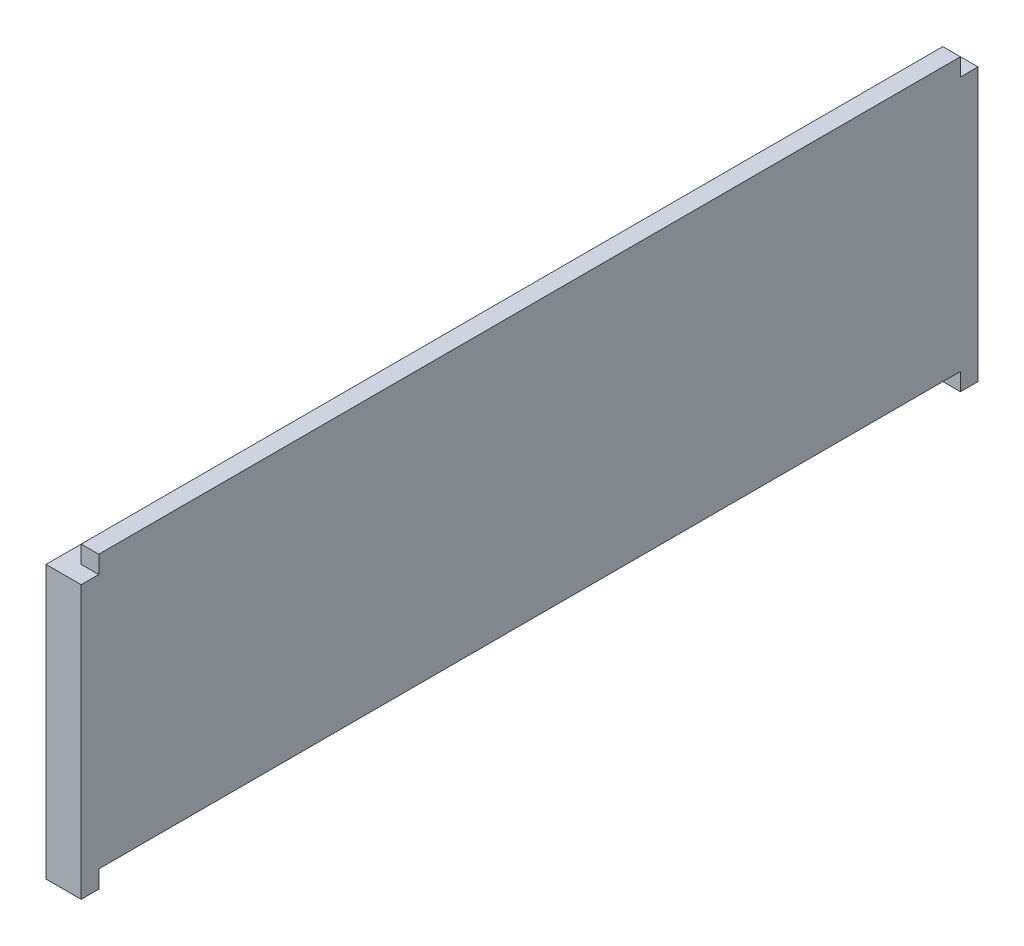
ISO-10303-21;
HEADER;
FILE_DESCRIPTION(('STEP AP214'),'2;1');
FILE_NAME('part.step','',(''),(''),'','','');
FILE_SCHEMA(('AUTOMOTIVE_DESIGN { 1 0 10303 214 1 1 1 1 }'));
ENDSEC;
DATA;
#1=APPLICATION_CONTEXT('core data for automotive mechanical design processes');
#2=APPLICATION_PROTOCOL_DEFINITION('international standard','automotive_design',2000,#1);
#3=PRODUCT_CONTEXT('',#1,'mechanical');
#4=PRODUCT('Part','Part','',(#3));
#5=PRODUCT_RELATED_PRODUCT_CATEGORY('part','',(#4));
#6=PRODUCT_DEFINITION_FORMATION('','',#4);
#7=PRODUCT_DEFINITION_CONTEXT('part definition',#1,'design');
#8=PRODUCT_DEFINITION('design','',#6,#7);
#9=PRODUCT_DEFINITION_SHAPE('','',#8);
#10=(LENGTH_UNIT() NAMED_UNIT(*) SI_UNIT(.MILLI.,.METRE.));
#11=(NAMED_UNIT(*) PLANE_ANGLE_UNIT() SI_UNIT($,.RADIAN.));
#12=(NAMED_UNIT(*) SI_UNIT($,.STERADIAN.) SOLID_ANGLE_UNIT());
#13=UNCERTAINTY_MEASURE_WITH_UNIT(LENGTH_MEASURE(1.E-05),#10,'distance_accuracy_value','');
#14=(GEOMETRIC_REPRESENTATION_CONTEXT(3) GLOBAL_UNCERTAINTY_ASSIGNED_CONTEXT((#13)) GLOBAL_UNIT_ASSIGNED_CONTEXT((#10,
#11,#12)) REPRESENTATION_CONTEXT('',''));
#15=CARTESIAN_POINT('',(0.,0.,0.));
#16=DIRECTION('',(0.,0.,1.));
#17=DIRECTION('',(1.,0.,0.));
#18=AXIS2_PLACEMENT_3D('',#15,#16,#17);
#19=CARTESIAN_POINT('',(10.,0.,490.));
#20=DIRECTION('',(0.,1.,0.));
#21=DIRECTION('',(-1.,0.,0.));
#22=AXIS2_PLACEMENT_3D('',#19,#20,#21);
#23=PLANE('',#22);
#24=DIRECTION('',(0.,0.,-1.));
#25=VECTOR('',#24,1.);
#26=CARTESIAN_POINT('',(0.,0.,490.));
#27=LINE('',#26,#25);
#28=CARTESIAN_POINT('',(0.,0.,500.));
#29=VERTEX_POINT('',#28);
#30=CARTESIAN_POINT('',(0.,0.,-10.));
#31=VERTEX_POINT('',#30);
#32=EDGE_CURVE('E138',#29,#31,#27,.T.);
#33=ORIENTED_EDGE('',*,*,#32,.T.);
#34=DIRECTION('',(-1.,0.,0.));
#35=VECTOR('',#34,1.);
#36=CARTESIAN_POINT('',(0.,0.,-10.));
#37=LINE('',#36,#35);
#38=CARTESIAN_POINT('',(20.,0.,-10.));
#39=VERTEX_POINT('',#38);
#40=EDGE_CURVE('E273',#39,#31,#37,.T.);
#41=ORIENTED_EDGE('',*,*,#40,.F.);
#42=DIRECTION('',(0.,0.,1.));
#43=VECTOR('',#42,1.);
#44=CARTESIAN_POINT('',(20.,0.,-10.));
#45=LINE('',#44,#43);
#46=CARTESIAN_POINT('',(20.,0.,0.));
#47=VERTEX_POINT('',#46);
#48=EDGE_CURVE('E280',#39,#47,#45,.T.);
#49=ORIENTED_EDGE('',*,*,#48,.T.);
#50=DIRECTION('',(-1.,0.,0.));
#51=VECTOR('',#50,1.);
#52=CARTESIAN_POINT('',(0.,0.,0.));
#53=LINE('',#52,#51);
#54=CARTESIAN_POINT('',(10.,0.,0.));
#55=VERTEX_POINT('',#54);
#56=EDGE_CURVE('E224',#47,#55,#53,.T.);
#57=ORIENTED_EDGE('',*,*,#56,.T.);
#58=DIRECTION('',(0.,0.,-1.));
#59=VECTOR('',#58,1.);
#60=CARTESIAN_POINT('',(10.,0.,490.));
#61=LINE('',#60,#59);
#62=CARTESIAN_POINT('',(10.,0.,490.));
#63=VERTEX_POINT('',#62);
#64=EDGE_CURVE('E41',#63,#55,#61,.T.);
#65=ORIENTED_EDGE('',*,*,#64,.F.);
#66=DIRECTION('',(1.,0.,0.));
#67=VECTOR('',#66,1.);
#68=CARTESIAN_POINT('',(0.,0.,490.));
#69=LINE('',#68,#67);
#70=CARTESIAN_POINT('',(20.,0.,490.));
#71=VERTEX_POINT('',#70);
#72=EDGE_CURVE('E113',#63,#71,#69,.T.);
#73=ORIENTED_EDGE('',*,*,#72,.T.);
#74=DIRECTION('',(0.,0.,-1.));
#75=VECTOR('',#74,1.);
#76=CARTESIAN_POINT('',(20.,0.,500.));
#77=LINE('',#76,#75);
#78=CARTESIAN_POINT('',(20.,0.,500.));
#79=VERTEX_POINT('',#78);
#80=EDGE_CURVE('E128',#79,#71,#77,.T.);
#81=ORIENTED_EDGE('',*,*,#80,.F.);
#82=DIRECTION('',(1.,0.,0.));
#83=VECTOR('',#82,1.);
#84=CARTESIAN_POINT('',(0.,0.,500.));
#85=LINE('',#84,#83);
#86=EDGE_CURVE('E80',#29,#79,#85,.T.);
#87=ORIENTED_EDGE('',*,*,#86,.F.);
#88=EDGE_LOOP('',(#33,#41,#49,#57,#65,#73,#81,#87));
#89=FACE_BOUND('',#88,.T.);
#90=ADVANCED_FACE('F34',(#89),#23,.F.);
#91=CARTESIAN_POINT('',(10.,10.,490.));
#92=DIRECTION('',(-1.,0.,0.));
#93=DIRECTION('',(0.,-1.,0.));
#94=AXIS2_PLACEMENT_3D('',#91,#92,#93);
#95=PLANE('',#94);
#96=DIRECTION('',(0.,1.,0.));
#97=VECTOR('',#96,1.);
#98=CARTESIAN_POINT('',(10.,10.,0.));
#99=LINE('',#98,#97);
#100=CARTESIAN_POINT('',(10.,10.,0.));
#101=VERTEX_POINT('',#100);
#102=EDGE_CURVE('E98',#55,#101,#99,.T.);
#103=ORIENTED_EDGE('',*,*,#102,.T.);
#104=DIRECTION('',(0.,0.,-1.));
#105=VECTOR('',#104,1.);
#106=CARTESIAN_POINT('',(10.,10.,490.));
#107=LINE('',#106,#105);
#108=CARTESIAN_POINT('',(10.,10.,490.));
#109=VERTEX_POINT('',#108);
#110=EDGE_CURVE('E91',#109,#101,#107,.T.);
#111=ORIENTED_EDGE('',*,*,#110,.F.);
#112=DIRECTION('',(0.,1.,0.));
#113=VECTOR('',#112,1.);
#114=CARTESIAN_POINT('',(10.,10.,490.));
#115=LINE('',#114,#113);
#116=EDGE_CURVE('E96',#63,#109,#115,.T.);
#117=ORIENTED_EDGE('',*,*,#116,.F.);
#118=ORIENTED_EDGE('',*,*,#64,.T.);
#119=EDGE_LOOP('',(#103,#111,#117,#118));
#120=FACE_BOUND('',#119,.T.);
#121=ADVANCED_FACE('F93',(#120),#95,.F.);
#122=CARTESIAN_POINT('',(20.,10.,490.));
#123=DIRECTION('',(0.,1.,0.));
#124=DIRECTION('',(-1.,0.,0.));
#125=AXIS2_PLACEMENT_3D('',#122,#123,#124);
#126=PLANE('',#125);
#127=DIRECTION('',(1.,0.,0.));
#128=VECTOR('',#127,1.);
#129=CARTESIAN_POINT('',(20.,10.,0.));
#130=LINE('',#129,#128);
#131=CARTESIAN_POINT('',(20.,10.,0.));
#132=VERTEX_POINT('',#131);
#133=EDGE_CURVE('E69',#101,#132,#130,.T.);
#134=ORIENTED_EDGE('',*,*,#133,.T.);
#135=DIRECTION('',(0.,0.,-1.));
#136=VECTOR('',#135,1.);
#137=CARTESIAN_POINT('',(20.,10.,490.));
#138=LINE('',#137,#136);
#139=CARTESIAN_POINT('',(20.,10.,490.));
#140=VERTEX_POINT('',#139);
#141=EDGE_CURVE('E100',#140,#132,#138,.T.);
#142=ORIENTED_EDGE('',*,*,#141,.F.);
#143=DIRECTION('',(1.,0.,0.));
#144=VECTOR('',#143,1.);
#145=CARTESIAN_POINT('',(20.,10.,490.));
#146=LINE('',#145,#144);
#147=EDGE_CURVE('E103',#109,#140,#146,.T.);
#148=ORIENTED_EDGE('',*,*,#147,.F.);
#149=ORIENTED_EDGE('',*,*,#110,.T.);
#150=EDGE_LOOP('',(#134,#142,#148,#149));
#151=FACE_BOUND('',#150,.T.);
#152=ADVANCED_FACE('F104',(#151),#126,.F.);
#153=CARTESIAN_POINT('',(20.,165.,490.));
#154=DIRECTION('',(-1.,0.,0.));
#155=DIRECTION('',(0.,-1.,0.));
#156=AXIS2_PLACEMENT_3D('',#153,#154,#155);
#157=PLANE('',#156);
#158=DIRECTION('',(0.,-1.,0.));
#159=VECTOR('',#158,1.);
#160=CARTESIAN_POINT('',(20.,0.,-10.));
#161=LINE('',#160,#159);
#162=CARTESIAN_POINT('',(20.,155.,-10.));
#163=VERTEX_POINT('',#162);
#164=EDGE_CURVE('E279',#163,#39,#161,.T.);
#165=ORIENTED_EDGE('',*,*,#164,.F.);
#166=DIRECTION('',(0.,0.,-1.));
#167=VECTOR('',#166,1.);
#168=CARTESIAN_POINT('',(20.,155.,-10.));
#169=LINE('',#168,#167);
#170=CARTESIAN_POINT('',(20.,155.,0.));
#171=VERTEX_POINT('',#170);
#172=EDGE_CURVE('E47',#171,#163,#169,.T.);
#173=ORIENTED_EDGE('',*,*,#172,.F.);
#174=DIRECTION('',(0.,-1.,0.));
#175=VECTOR('',#174,1.);
#176=CARTESIAN_POINT('',(20.,165.,0.));
#177=LINE('',#176,#175);
#178=CARTESIAN_POINT('',(20.,165.,0.));
#179=VERTEX_POINT('',#178);
#180=EDGE_CURVE('E210',#179,#171,#177,.T.);
#181=ORIENTED_EDGE('',*,*,#180,.F.);
#182=DIRECTION('',(0.,0.,-1.));
#183=VECTOR('',#182,1.);
#184=CARTESIAN_POINT('',(20.,165.,490.));
#185=LINE('',#184,#183);
#186=CARTESIAN_POINT('',(20.,165.,490.));
#187=VERTEX_POINT('',#186);
#188=EDGE_CURVE('E145',#187,#179,#185,.T.);
#189=ORIENTED_EDGE('',*,*,#188,.F.);
#190=DIRECTION('',(0.,1.,0.));
#191=VECTOR('',#190,1.);
#192=CARTESIAN_POINT('',(20.,165.,490.));
#193=LINE('',#192,#191);
#194=CARTESIAN_POINT('',(20.,155.,490.));
#195=VERTEX_POINT('',#194);
#196=EDGE_CURVE('E236',#195,#187,#193,.T.);
#197=ORIENTED_EDGE('',*,*,#196,.F.);
#198=DIRECTION('',(0.,0.,-1.));
#199=VECTOR('',#198,1.);
#200=CARTESIAN_POINT('',(20.,155.,500.));
#201=LINE('',#200,#199);
#202=CARTESIAN_POINT('',(20.,155.,500.));
#203=VERTEX_POINT('',#202);
#204=EDGE_CURVE('E241',#203,#195,#201,.T.);
#205=ORIENTED_EDGE('',*,*,#204,.F.);
#206=DIRECTION('',(0.,1.,0.));
#207=VECTOR('',#206,1.);
#208=CARTESIAN_POINT('',(20.,0.,500.));
#209=LINE('',#208,#207);
#210=EDGE_CURVE('E294',#79,#203,#209,.T.);
#211=ORIENTED_EDGE('',*,*,#210,.F.);
#212=ORIENTED_EDGE('',*,*,#80,.T.);
#213=DIRECTION('',(0.,1.,0.));
#214=VECTOR('',#213,1.);
#215=CARTESIAN_POINT('',(20.,0.,490.));
#216=LINE('',#215,#214);
#217=EDGE_CURVE('E167',#71,#140,#216,.T.);
#218=ORIENTED_EDGE('',*,*,#217,.T.);
#219=ORIENTED_EDGE('',*,*,#141,.T.);
#220=DIRECTION('',(0.,-1.,0.));
#221=VECTOR('',#220,1.);
#222=CARTESIAN_POINT('',(20.,0.,0.));
#223=LINE('',#222,#221);
#224=EDGE_CURVE('E164',#132,#47,#223,.T.);
#225=ORIENTED_EDGE('',*,*,#224,.T.);
#226=ORIENTED_EDGE('',*,*,#48,.F.);
#227=EDGE_LOOP('',(#165,#173,#181,#189,#197,#205,#211,#212,#218,#219,#225,#226));
#228=FACE_BOUND('',#227,.T.);
#229=ADVANCED_FACE('F161',(#228),#157,.F.);
#230=CARTESIAN_POINT('',(10.,165.,490.));
#231=DIRECTION('',(0.,-1.,0.));
#232=DIRECTION('',(0.,0.,-1.));
#233=AXIS2_PLACEMENT_3D('',#230,#231,#232);
#234=PLANE('',#233);
#235=ORIENTED_EDGE('',*,*,#188,.T.);
#236=DIRECTION('',(1.,0.,0.));
#237=VECTOR('',#236,1.);
#238=CARTESIAN_POINT('',(-5.00000000222545E-05,165.,0.));
#239=LINE('',#238,#237);
#240=CARTESIAN_POINT('',(10.,165.,0.));
#241=VERTEX_POINT('',#240);
#242=EDGE_CURVE('E207',#241,#179,#239,.T.);
#243=ORIENTED_EDGE('',*,*,#242,.F.);
#244=DIRECTION('',(0.,0.,-1.));
#245=VECTOR('',#244,1.);
#246=CARTESIAN_POINT('',(10.,165.,490.));
#247=LINE('',#246,#245);
#248=CARTESIAN_POINT('',(10.,165.,490.));
#249=VERTEX_POINT('',#248);
#250=EDGE_CURVE('E144',#249,#241,#247,.T.);
#251=ORIENTED_EDGE('',*,*,#250,.F.);
#252=DIRECTION('',(1.,0.,0.));
#253=VECTOR('',#252,1.);
#254=CARTESIAN_POINT('',(-5.00000000222545E-05,165.,490.));
#255=LINE('',#254,#253);
#256=EDGE_CURVE('E220',#249,#187,#255,.T.);
#257=ORIENTED_EDGE('',*,*,#256,.T.);
#258=EDGE_LOOP('',(#235,#243,#251,#257));
#259=FACE_BOUND('',#258,.T.);
#260=ADVANCED_FACE('F219',(#259),#234,.F.);
#261=CARTESIAN_POINT('',(10.,155.,490.));
#262=DIRECTION('',(1.,0.,0.));
#263=DIRECTION('',(0.,0.,-1.));
#264=AXIS2_PLACEMENT_3D('',#261,#262,#263);
#265=PLANE('',#264);
#266=DIRECTION('',(0.,-1.,0.));
#267=VECTOR('',#266,1.);
#268=CARTESIAN_POINT('',(10.,155.,0.));
#269=LINE('',#268,#267);
#270=CARTESIAN_POINT('',(10.,155.,0.));
#271=VERTEX_POINT('',#270);
#272=EDGE_CURVE('E114',#241,#271,#269,.T.);
#273=ORIENTED_EDGE('',*,*,#272,.T.);
#274=DIRECTION('',(0.,0.,-1.));
#275=VECTOR('',#274,1.);
#276=CARTESIAN_POINT('',(10.,155.,490.));
#277=LINE('',#276,#275);
#278=CARTESIAN_POINT('',(10.,155.,490.));
#279=VERTEX_POINT('',#278);
#280=EDGE_CURVE('E142',#279,#271,#277,.T.);
#281=ORIENTED_EDGE('',*,*,#280,.F.);
#282=DIRECTION('',(0.,-1.,0.));
#283=VECTOR('',#282,1.);
#284=CARTESIAN_POINT('',(10.,155.,490.));
#285=LINE('',#284,#283);
#286=EDGE_CURVE('E109',#249,#279,#285,.T.);
#287=ORIENTED_EDGE('',*,*,#286,.F.);
#288=ORIENTED_EDGE('',*,*,#250,.T.);
#289=EDGE_LOOP('',(#273,#281,#287,#288));
#290=FACE_BOUND('',#289,.T.);
#291=ADVANCED_FACE('F251',(#290),#265,.F.);
#292=CARTESIAN_POINT('',(0.,155.,490.));
#293=DIRECTION('',(0.,-1.,0.));
#294=DIRECTION('',(0.,0.,-1.));
#295=AXIS2_PLACEMENT_3D('',#292,#293,#294);
#296=PLANE('',#295);
#297=ORIENTED_EDGE('',*,*,#280,.T.);
#298=DIRECTION('',(1.,0.,0.));
#299=VECTOR('',#298,1.);
#300=CARTESIAN_POINT('',(-5.00000000222545E-05,155.,0.));
#301=LINE('',#300,#299);
#302=EDGE_CURVE('E213',#271,#171,#301,.T.);
#303=ORIENTED_EDGE('',*,*,#302,.T.);
#304=ORIENTED_EDGE('',*,*,#172,.T.);
#305=DIRECTION('',(-1.,0.,0.));
#306=VECTOR('',#305,1.);
#307=CARTESIAN_POINT('',(0.,155.,-10.));
#308=LINE('',#307,#306);
#309=CARTESIAN_POINT('',(0.,155.,-10.));
#310=VERTEX_POINT('',#309);
#311=EDGE_CURVE('E11',#163,#310,#308,.T.);
#312=ORIENTED_EDGE('',*,*,#311,.T.);
#313=DIRECTION('',(0.,0.,-1.));
#314=VECTOR('',#313,1.);
#315=CARTESIAN_POINT('',(0.,155.,490.));
#316=LINE('',#315,#314);
#317=CARTESIAN_POINT('',(0.,155.,500.));
#318=VERTEX_POINT('',#317);
#319=EDGE_CURVE('E141',#318,#310,#316,.T.);
#320=ORIENTED_EDGE('',*,*,#319,.F.);
#321=DIRECTION('',(1.,0.,0.));
#322=VECTOR('',#321,1.);
#323=CARTESIAN_POINT('',(-5.00000000222545E-05,155.,500.));
#324=LINE('',#323,#322);
#325=EDGE_CURVE('E226',#318,#203,#324,.T.);
#326=ORIENTED_EDGE('',*,*,#325,.T.);
#327=ORIENTED_EDGE('',*,*,#204,.T.);
#328=DIRECTION('',(1.,0.,0.));
#329=VECTOR('',#328,1.);
#330=CARTESIAN_POINT('',(-5.00000000222545E-05,155.,490.));
#331=LINE('',#330,#329);
#332=EDGE_CURVE('E55',#279,#195,#331,.T.);
#333=ORIENTED_EDGE('',*,*,#332,.F.);
#334=EDGE_LOOP('',(#297,#303,#304,#312,#320,#326,#327,#333));
#335=FACE_BOUND('',#334,.T.);
#336=ADVANCED_FACE('F248',(#335),#296,.F.);
#337=CARTESIAN_POINT('',(0.,0.,490.));
#338=DIRECTION('',(1.,0.,0.));
#339=DIRECTION('',(0.,0.,-1.));
#340=AXIS2_PLACEMENT_3D('',#337,#338,#339);
#341=PLANE('',#340);
#342=ORIENTED_EDGE('',*,*,#319,.T.);
#343=DIRECTION('',(0.,1.,0.));
#344=VECTOR('',#343,1.);
#345=CARTESIAN_POINT('',(0.,0.,-10.));
#346=LINE('',#345,#344);
#347=EDGE_CURVE('E232',#31,#310,#346,.T.);
#348=ORIENTED_EDGE('',*,*,#347,.F.);
#349=ORIENTED_EDGE('',*,*,#32,.F.);
#350=DIRECTION('',(0.,-1.,0.));
#351=VECTOR('',#350,1.);
#352=CARTESIAN_POINT('',(0.,0.,500.));
#353=LINE('',#352,#351);
#354=EDGE_CURVE('E291',#318,#29,#353,.T.);
#355=ORIENTED_EDGE('',*,*,#354,.F.);
#356=EDGE_LOOP('',(#342,#348,#349,#355));
#357=FACE_BOUND('',#356,.T.);
#358=ADVANCED_FACE('F282',(#357),#341,.F.);
#359=CARTESIAN_POINT('',(0.,0.,490.));
#360=DIRECTION('',(0.,0.,-1.));
#361=DIRECTION('',(-1.,0.,0.));
#362=AXIS2_PLACEMENT_3D('',#359,#360,#361);
#363=PLANE('',#362);
#364=ORIENTED_EDGE('',*,*,#72,.F.);
#365=ORIENTED_EDGE('',*,*,#116,.T.);
#366=ORIENTED_EDGE('',*,*,#147,.T.);
#367=ORIENTED_EDGE('',*,*,#217,.F.);
#368=EDGE_LOOP('',(#364,#365,#366,#367));
#369=FACE_BOUND('',#368,.T.);
#370=ADVANCED_FACE('F112',(#369),#363,.T.);
#371=CARTESIAN_POINT('',(0.,0.,500.));
#372=DIRECTION('',(0.,0.,-1.));
#373=DIRECTION('',(-1.,0.,0.));
#374=AXIS2_PLACEMENT_3D('',#371,#372,#373);
#375=PLANE('',#374);
#376=ORIENTED_EDGE('',*,*,#210,.T.);
#377=ORIENTED_EDGE('',*,*,#325,.F.);
#378=ORIENTED_EDGE('',*,*,#354,.T.);
#379=ORIENTED_EDGE('',*,*,#86,.T.);
#380=EDGE_LOOP('',(#376,#377,#378,#379));
#381=FACE_BOUND('',#380,.T.);
#382=ADVANCED_FACE('F302',(#381),#375,.F.);
#383=CARTESIAN_POINT('',(0.,0.,-10.));
#384=DIRECTION('',(0.,0.,-1.));
#385=DIRECTION('',(-1.,0.,0.));
#386=AXIS2_PLACEMENT_3D('',#383,#384,#385);
#387=PLANE('',#386);
#388=ORIENTED_EDGE('',*,*,#311,.F.);
#389=ORIENTED_EDGE('',*,*,#164,.T.);
#390=ORIENTED_EDGE('',*,*,#40,.T.);
#391=ORIENTED_EDGE('',*,*,#347,.T.);
#392=EDGE_LOOP('',(#388,#389,#390,#391));
#393=FACE_BOUND('',#392,.T.);
#394=ADVANCED_FACE('F262',(#393),#387,.T.);
#395=CARTESIAN_POINT('',(0.,0.,0.));
#396=DIRECTION('',(0.,0.,-1.));
#397=DIRECTION('',(-1.,0.,0.));
#398=AXIS2_PLACEMENT_3D('',#395,#396,#397);
#399=PLANE('',#398);
#400=ORIENTED_EDGE('',*,*,#133,.F.);
#401=ORIENTED_EDGE('',*,*,#102,.F.);
#402=ORIENTED_EDGE('',*,*,#56,.F.);
#403=ORIENTED_EDGE('',*,*,#224,.F.);
#404=EDGE_LOOP('',(#400,#401,#402,#403));
#405=FACE_BOUND('',#404,.T.);
#406=ADVANCED_FACE('F254',(#405),#399,.F.);
#407=CARTESIAN_POINT('',(-5.00000000222545E-05,165.,490.));
#408=DIRECTION('',(0.,0.,-1.));
#409=DIRECTION('',(-1.,0.,0.));
#410=AXIS2_PLACEMENT_3D('',#407,#408,#409);
#411=PLANE('',#410);
#412=ORIENTED_EDGE('',*,*,#332,.T.);
#413=ORIENTED_EDGE('',*,*,#196,.T.);
#414=ORIENTED_EDGE('',*,*,#256,.F.);
#415=ORIENTED_EDGE('',*,*,#286,.T.);
#416=EDGE_LOOP('',(#412,#413,#414,#415));
#417=FACE_BOUND('',#416,.T.);
#418=ADVANCED_FACE('F252',(#417),#411,.F.);
#419=CARTESIAN_POINT('',(-5.00000000222545E-05,165.,0.));
#420=DIRECTION('',(0.,0.,1.));
#421=DIRECTION('',(1.,0.,0.));
#422=AXIS2_PLACEMENT_3D('',#419,#420,#421);
#423=PLANE('',#422);
#424=ORIENTED_EDGE('',*,*,#242,.T.);
#425=ORIENTED_EDGE('',*,*,#180,.T.);
#426=ORIENTED_EDGE('',*,*,#302,.F.);
#427=ORIENTED_EDGE('',*,*,#272,.F.);
#428=EDGE_LOOP('',(#424,#425,#426,#427));
#429=FACE_BOUND('',#428,.T.);
#430=ADVANCED_FACE('F209',(#429),#423,.F.);
#431=CLOSED_SHELL('',(#90,#121,#152,#229,#260,#291,#336,#358,#370,#382,#394,#406,#418,#430));
#432=MANIFOLD_SOLID_BREP('B2',#431);
#433=ADVANCED_BREP_SHAPE_REPRESENTATION('',(#18,#432),#14);
#434=SHAPE_DEFINITION_REPRESENTATION(#9,#433);
ENDSEC;
END-ISO-10303-21;
